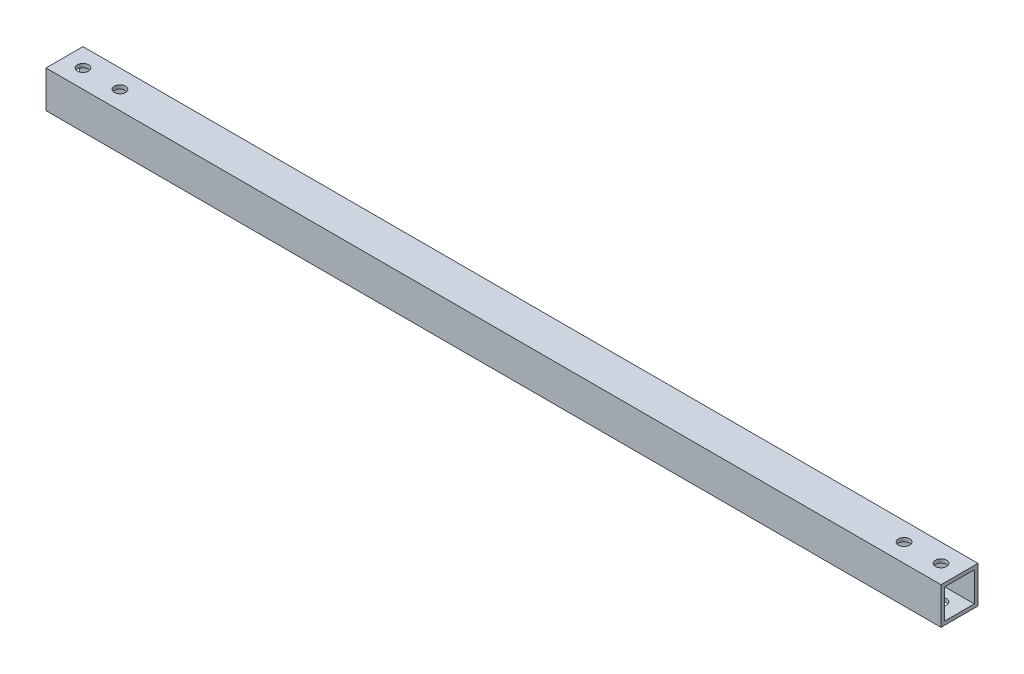
ISO-10303-21;
HEADER;
FILE_DESCRIPTION(('STEP AP214'),'2;1');
FILE_NAME('part.step','',(''),(''),'','','');
FILE_SCHEMA(('AUTOMOTIVE_DESIGN { 1 0 10303 214 1 1 1 1 }'));
ENDSEC;
DATA;
#1=APPLICATION_CONTEXT('core data for automotive mechanical design processes');
#2=APPLICATION_PROTOCOL_DEFINITION('international standard','automotive_design',2000,#1);
#3=PRODUCT_CONTEXT('',#1,'mechanical');
#4=PRODUCT('Part','Part','',(#3));
#5=PRODUCT_RELATED_PRODUCT_CATEGORY('part','',(#4));
#6=PRODUCT_DEFINITION_FORMATION('','',#4);
#7=PRODUCT_DEFINITION_CONTEXT('part definition',#1,'design');
#8=PRODUCT_DEFINITION('design','',#6,#7);
#9=PRODUCT_DEFINITION_SHAPE('','',#8);
#10=(LENGTH_UNIT() NAMED_UNIT(*) SI_UNIT(.MILLI.,.METRE.));
#11=(NAMED_UNIT(*) PLANE_ANGLE_UNIT() SI_UNIT($,.RADIAN.));
#12=(NAMED_UNIT(*) SI_UNIT($,.STERADIAN.) SOLID_ANGLE_UNIT());
#13=UNCERTAINTY_MEASURE_WITH_UNIT(LENGTH_MEASURE(1.E-05),#10,'distance_accuracy_value','');
#14=(GEOMETRIC_REPRESENTATION_CONTEXT(3) GLOBAL_UNCERTAINTY_ASSIGNED_CONTEXT((#13)) GLOBAL_UNIT_ASSIGNED_CONTEXT((#10,
#11,#12)) REPRESENTATION_CONTEXT('',''));
#15=CARTESIAN_POINT('',(0.,0.,0.));
#16=DIRECTION('',(0.,0.,1.));
#17=DIRECTION('',(1.,0.,0.));
#18=AXIS2_PLACEMENT_3D('',#15,#16,#17);
#19=CARTESIAN_POINT('',(242.,0.,0.));
#20=DIRECTION('',(1.,0.,0.));
#21=DIRECTION('',(0.,0.,-1.));
#22=AXIS2_PLACEMENT_3D('',#19,#20,#21);
#23=PLANE('',#22);
#24=DIRECTION('',(0.,-1.,0.));
#25=VECTOR('',#24,1.);
#26=CARTESIAN_POINT('',(242.,10.,10.));
#27=LINE('',#26,#25);
#28=CARTESIAN_POINT('',(242.,10.,10.));
#29=VERTEX_POINT('',#28);
#30=CARTESIAN_POINT('',(242.,-10.,10.));
#31=VERTEX_POINT('',#30);
#32=EDGE_CURVE('E138',#29,#31,#27,.T.);
#33=ORIENTED_EDGE('',*,*,#32,.T.);
#34=DIRECTION('',(0.,0.,-1.));
#35=VECTOR('',#34,1.);
#36=CARTESIAN_POINT('',(242.,-10.,10.));
#37=LINE('',#36,#35);
#38=CARTESIAN_POINT('',(242.,-10.,-10.));
#39=VERTEX_POINT('',#38);
#40=EDGE_CURVE('E141',#31,#39,#37,.T.);
#41=ORIENTED_EDGE('',*,*,#40,.T.);
#42=DIRECTION('',(0.,1.,0.));
#43=VECTOR('',#42,1.);
#44=CARTESIAN_POINT('',(242.,10.,-10.));
#45=LINE('',#44,#43);
#46=CARTESIAN_POINT('',(242.,10.,-10.));
#47=VERTEX_POINT('',#46);
#48=EDGE_CURVE('E144',#39,#47,#45,.T.);
#49=ORIENTED_EDGE('',*,*,#48,.T.);
#50=DIRECTION('',(0.,0.,1.));
#51=VECTOR('',#50,1.);
#52=CARTESIAN_POINT('',(242.,10.,10.));
#53=LINE('',#52,#51);
#54=EDGE_CURVE('E146',#47,#29,#53,.T.);
#55=ORIENTED_EDGE('',*,*,#54,.T.);
#56=EDGE_LOOP('',(#33,#41,#49,#55));
#57=FACE_BOUND('',#56,.T.);
#58=DIRECTION('',(0.,1.,0.));
#59=VECTOR('',#58,1.);
#60=CARTESIAN_POINT('',(242.,8.,-8.));
#61=LINE('',#60,#59);
#62=CARTESIAN_POINT('',(242.,-8.,-8.));
#63=VERTEX_POINT('',#62);
#64=CARTESIAN_POINT('',(242.,8.,-8.));
#65=VERTEX_POINT('',#64);
#66=EDGE_CURVE('E108',#63,#65,#61,.T.);
#67=ORIENTED_EDGE('',*,*,#66,.F.);
#68=DIRECTION('',(0.,0.,-1.));
#69=VECTOR('',#68,1.);
#70=CARTESIAN_POINT('',(242.,-8.,-8.));
#71=LINE('',#70,#69);
#72=CARTESIAN_POINT('',(242.,-8.,8.));
#73=VERTEX_POINT('',#72);
#74=EDGE_CURVE('E100',#73,#63,#71,.T.);
#75=ORIENTED_EDGE('',*,*,#74,.F.);
#76=DIRECTION('',(0.,-1.,0.));
#77=VECTOR('',#76,1.);
#78=CARTESIAN_POINT('',(242.,8.,8.));
#79=LINE('',#78,#77);
#80=CARTESIAN_POINT('',(242.,8.,8.));
#81=VERTEX_POINT('',#80);
#82=EDGE_CURVE('E122',#81,#73,#79,.T.);
#83=ORIENTED_EDGE('',*,*,#82,.F.);
#84=DIRECTION('',(0.,0.,1.));
#85=VECTOR('',#84,1.);
#86=CARTESIAN_POINT('',(242.,8.,-8.));
#87=LINE('',#86,#85);
#88=EDGE_CURVE('E120',#65,#81,#87,.T.);
#89=ORIENTED_EDGE('',*,*,#88,.F.);
#90=EDGE_LOOP('',(#67,#75,#83,#89));
#91=FACE_BOUND('',#90,.T.);
#92=ADVANCED_FACE('F33',(#57,#91),#23,.T.);
#93=CARTESIAN_POINT('',(-242.,0.,0.));
#94=DIRECTION('',(1.,0.,0.));
#95=DIRECTION('',(0.,0.,-1.));
#96=AXIS2_PLACEMENT_3D('',#93,#94,#95);
#97=PLANE('',#96);
#98=DIRECTION('',(0.,-1.,0.));
#99=VECTOR('',#98,1.);
#100=CARTESIAN_POINT('',(-242.,10.,10.));
#101=LINE('',#100,#99);
#102=CARTESIAN_POINT('',(-242.,10.,10.));
#103=VERTEX_POINT('',#102);
#104=CARTESIAN_POINT('',(-242.,-10.,10.));
#105=VERTEX_POINT('',#104);
#106=EDGE_CURVE('E116',#103,#105,#101,.T.);
#107=ORIENTED_EDGE('',*,*,#106,.F.);
#108=DIRECTION('',(0.,0.,1.));
#109=VECTOR('',#108,1.);
#110=CARTESIAN_POINT('',(-242.,10.,10.));
#111=LINE('',#110,#109);
#112=CARTESIAN_POINT('',(-242.,10.,-10.));
#113=VERTEX_POINT('',#112);
#114=EDGE_CURVE('E142',#113,#103,#111,.T.);
#115=ORIENTED_EDGE('',*,*,#114,.F.);
#116=DIRECTION('',(0.,1.,0.));
#117=VECTOR('',#116,1.);
#118=CARTESIAN_POINT('',(-242.,10.,-10.));
#119=LINE('',#118,#117);
#120=CARTESIAN_POINT('',(-242.,-10.,-10.));
#121=VERTEX_POINT('',#120);
#122=EDGE_CURVE('E153',#121,#113,#119,.T.);
#123=ORIENTED_EDGE('',*,*,#122,.F.);
#124=DIRECTION('',(0.,0.,-1.));
#125=VECTOR('',#124,1.);
#126=CARTESIAN_POINT('',(-242.,-10.,10.));
#127=LINE('',#126,#125);
#128=EDGE_CURVE('E151',#105,#121,#127,.T.);
#129=ORIENTED_EDGE('',*,*,#128,.F.);
#130=EDGE_LOOP('',(#107,#115,#123,#129));
#131=FACE_BOUND('',#130,.T.);
#132=DIRECTION('',(0.,0.,-1.));
#133=VECTOR('',#132,1.);
#134=CARTESIAN_POINT('',(-242.,-8.,-8.));
#135=LINE('',#134,#133);
#136=CARTESIAN_POINT('',(-242.,-8.,8.));
#137=VERTEX_POINT('',#136);
#138=CARTESIAN_POINT('',(-242.,-8.,-8.));
#139=VERTEX_POINT('',#138);
#140=EDGE_CURVE('E58',#137,#139,#135,.T.);
#141=ORIENTED_EDGE('',*,*,#140,.T.);
#142=DIRECTION('',(0.,1.,0.));
#143=VECTOR('',#142,1.);
#144=CARTESIAN_POINT('',(-242.,8.,-8.));
#145=LINE('',#144,#143);
#146=CARTESIAN_POINT('',(-242.,8.,-8.));
#147=VERTEX_POINT('',#146);
#148=EDGE_CURVE('E115',#139,#147,#145,.T.);
#149=ORIENTED_EDGE('',*,*,#148,.T.);
#150=DIRECTION('',(0.,0.,1.));
#151=VECTOR('',#150,1.);
#152=CARTESIAN_POINT('',(-242.,8.,-8.));
#153=LINE('',#152,#151);
#154=CARTESIAN_POINT('',(-242.,8.,8.));
#155=VERTEX_POINT('',#154);
#156=EDGE_CURVE('E130',#147,#155,#153,.T.);
#157=ORIENTED_EDGE('',*,*,#156,.T.);
#158=DIRECTION('',(0.,-1.,0.));
#159=VECTOR('',#158,1.);
#160=CARTESIAN_POINT('',(-242.,8.,8.));
#161=LINE('',#160,#159);
#162=EDGE_CURVE('E109',#155,#137,#161,.T.);
#163=ORIENTED_EDGE('',*,*,#162,.T.);
#164=EDGE_LOOP('',(#141,#149,#157,#163));
#165=FACE_BOUND('',#164,.T.);
#166=ADVANCED_FACE('F224',(#131,#165),#97,.F.);
#167=CARTESIAN_POINT('',(242.,10.,10.));
#168=DIRECTION('',(0.,0.,-1.));
#169=DIRECTION('',(-1.,0.,0.));
#170=AXIS2_PLACEMENT_3D('',#167,#168,#169);
#171=PLANE('',#170);
#172=ORIENTED_EDGE('',*,*,#106,.T.);
#173=DIRECTION('',(-1.,0.,0.));
#174=VECTOR('',#173,1.);
#175=CARTESIAN_POINT('',(242.,-10.,10.));
#176=LINE('',#175,#174);
#177=EDGE_CURVE('E11',#31,#105,#176,.T.);
#178=ORIENTED_EDGE('',*,*,#177,.F.);
#179=ORIENTED_EDGE('',*,*,#32,.F.);
#180=DIRECTION('',(-1.,0.,0.));
#181=VECTOR('',#180,1.);
#182=CARTESIAN_POINT('',(242.,10.,10.));
#183=LINE('',#182,#181);
#184=EDGE_CURVE('E148',#29,#103,#183,.T.);
#185=ORIENTED_EDGE('',*,*,#184,.T.);
#186=EDGE_LOOP('',(#172,#178,#179,#185));
#187=FACE_BOUND('',#186,.T.);
#188=ADVANCED_FACE('F35',(#187),#171,.F.);
#189=CARTESIAN_POINT('',(242.,-10.,10.));
#190=DIRECTION('',(0.,1.,0.));
#191=DIRECTION('',(0.,0.,1.));
#192=AXIS2_PLACEMENT_3D('',#189,#190,#191);
#193=PLANE('',#192);
#194=CARTESIAN_POINT('',(-212.,-10.,0.));
#195=DIRECTION('',(0.,1.,0.));
#196=DIRECTION('',(0.,0.,1.));
#197=AXIS2_PLACEMENT_3D('',#194,#195,#196);
#198=CIRCLE('',#197,2.99999999999999);
#199=CARTESIAN_POINT('',(-212.,-10.,2.99999999999999));
#200=VERTEX_POINT('',#199);
#201=EDGE_CURVE('E243',#200,#200,#198,.T.);
#202=ORIENTED_EDGE('',*,*,#201,.T.);
#203=EDGE_LOOP('',(#202));
#204=FACE_BOUND('',#203,.T.);
#205=CARTESIAN_POINT('',(-232.,-10.,0.));
#206=DIRECTION('',(0.,1.,0.));
#207=DIRECTION('',(0.,0.,1.));
#208=AXIS2_PLACEMENT_3D('',#205,#206,#207);
#209=CIRCLE('',#208,2.99999999999999);
#210=CARTESIAN_POINT('',(-232.,-10.,2.99999999999999));
#211=VERTEX_POINT('',#210);
#212=EDGE_CURVE('E174',#211,#211,#209,.T.);
#213=ORIENTED_EDGE('',*,*,#212,.T.);
#214=EDGE_LOOP('',(#213));
#215=FACE_BOUND('',#214,.T.);
#216=CARTESIAN_POINT('',(232.,-10.,0.));
#217=DIRECTION('',(0.,1.,0.));
#218=DIRECTION('',(0.,0.,1.));
#219=AXIS2_PLACEMENT_3D('',#216,#217,#218);
#220=CIRCLE('',#219,2.99999999999999);
#221=CARTESIAN_POINT('',(232.,-10.,2.99999999999999));
#222=VERTEX_POINT('',#221);
#223=EDGE_CURVE('E170',#222,#222,#220,.T.);
#224=ORIENTED_EDGE('',*,*,#223,.T.);
#225=EDGE_LOOP('',(#224));
#226=FACE_BOUND('',#225,.T.);
#227=CARTESIAN_POINT('',(212.,-10.,0.));
#228=DIRECTION('',(0.,1.,0.));
#229=DIRECTION('',(0.,0.,1.));
#230=AXIS2_PLACEMENT_3D('',#227,#228,#229);
#231=CIRCLE('',#230,2.99999999999999);
#232=CARTESIAN_POINT('',(212.,-10.,2.99999999999999));
#233=VERTEX_POINT('',#232);
#234=EDGE_CURVE('E166',#233,#233,#231,.T.);
#235=ORIENTED_EDGE('',*,*,#234,.T.);
#236=EDGE_LOOP('',(#235));
#237=FACE_BOUND('',#236,.T.);
#238=ORIENTED_EDGE('',*,*,#128,.T.);
#239=DIRECTION('',(-1.,0.,0.));
#240=VECTOR('',#239,1.);
#241=CARTESIAN_POINT('',(242.,-10.,-10.));
#242=LINE('',#241,#240);
#243=EDGE_CURVE('E42',#39,#121,#242,.T.);
#244=ORIENTED_EDGE('',*,*,#243,.F.);
#245=ORIENTED_EDGE('',*,*,#40,.F.);
#246=ORIENTED_EDGE('',*,*,#177,.T.);
#247=EDGE_LOOP('',(#238,#244,#245,#246));
#248=FACE_BOUND('',#247,.T.);
#249=ADVANCED_FACE('F233',(#204,#215,#226,#237,#248),#193,.F.);
#250=CARTESIAN_POINT('',(242.,10.,-10.));
#251=DIRECTION('',(0.,0.,1.));
#252=DIRECTION('',(1.,0.,0.));
#253=AXIS2_PLACEMENT_3D('',#250,#251,#252);
#254=PLANE('',#253);
#255=ORIENTED_EDGE('',*,*,#122,.T.);
#256=DIRECTION('',(-1.,0.,0.));
#257=VECTOR('',#256,1.);
#258=CARTESIAN_POINT('',(242.,10.,-10.));
#259=LINE('',#258,#257);
#260=EDGE_CURVE('E158',#47,#113,#259,.T.);
#261=ORIENTED_EDGE('',*,*,#260,.F.);
#262=ORIENTED_EDGE('',*,*,#48,.F.);
#263=ORIENTED_EDGE('',*,*,#243,.T.);
#264=EDGE_LOOP('',(#255,#261,#262,#263));
#265=FACE_BOUND('',#264,.T.);
#266=ADVANCED_FACE('F217',(#265),#254,.F.);
#267=CARTESIAN_POINT('',(242.,10.,10.));
#268=DIRECTION('',(0.,-1.,0.));
#269=DIRECTION('',(0.,0.,-1.));
#270=AXIS2_PLACEMENT_3D('',#267,#268,#269);
#271=PLANE('',#270);
#272=CARTESIAN_POINT('',(-212.,10.,0.));
#273=DIRECTION('',(0.,1.,0.));
#274=DIRECTION('',(0.,0.,1.));
#275=AXIS2_PLACEMENT_3D('',#272,#273,#274);
#276=CIRCLE('',#275,2.99999999999999);
#277=CARTESIAN_POINT('',(-212.,10.,2.99999999999999));
#278=VERTEX_POINT('',#277);
#279=EDGE_CURVE('E299',#278,#278,#276,.T.);
#280=ORIENTED_EDGE('',*,*,#279,.F.);
#281=EDGE_LOOP('',(#280));
#282=FACE_BOUND('',#281,.T.);
#283=CARTESIAN_POINT('',(-232.,10.,0.));
#284=DIRECTION('',(0.,1.,0.));
#285=DIRECTION('',(0.,0.,1.));
#286=AXIS2_PLACEMENT_3D('',#283,#284,#285);
#287=CIRCLE('',#286,2.99999999999999);
#288=CARTESIAN_POINT('',(-232.,10.,2.99999999999999));
#289=VERTEX_POINT('',#288);
#290=EDGE_CURVE('E181',#289,#289,#287,.T.);
#291=ORIENTED_EDGE('',*,*,#290,.F.);
#292=EDGE_LOOP('',(#291));
#293=FACE_BOUND('',#292,.T.);
#294=CARTESIAN_POINT('',(232.,10.,0.));
#295=DIRECTION('',(0.,1.,0.));
#296=DIRECTION('',(0.,0.,1.));
#297=AXIS2_PLACEMENT_3D('',#294,#295,#296);
#298=CIRCLE('',#297,2.99999999999999);
#299=CARTESIAN_POINT('',(232.,10.,2.99999999999999));
#300=VERTEX_POINT('',#299);
#301=EDGE_CURVE('E178',#300,#300,#298,.T.);
#302=ORIENTED_EDGE('',*,*,#301,.F.);
#303=EDGE_LOOP('',(#302));
#304=FACE_BOUND('',#303,.T.);
#305=CARTESIAN_POINT('',(212.,10.,0.));
#306=DIRECTION('',(0.,1.,0.));
#307=DIRECTION('',(0.,0.,1.));
#308=AXIS2_PLACEMENT_3D('',#305,#306,#307);
#309=CIRCLE('',#308,2.99999999999999);
#310=CARTESIAN_POINT('',(212.,10.,2.99999999999999));
#311=VERTEX_POINT('',#310);
#312=EDGE_CURVE('E197',#311,#311,#309,.T.);
#313=ORIENTED_EDGE('',*,*,#312,.F.);
#314=EDGE_LOOP('',(#313));
#315=FACE_BOUND('',#314,.T.);
#316=ORIENTED_EDGE('',*,*,#114,.T.);
#317=ORIENTED_EDGE('',*,*,#184,.F.);
#318=ORIENTED_EDGE('',*,*,#54,.F.);
#319=ORIENTED_EDGE('',*,*,#260,.T.);
#320=EDGE_LOOP('',(#316,#317,#318,#319));
#321=FACE_BOUND('',#320,.T.);
#322=ADVANCED_FACE('F208',(#282,#293,#304,#315,#321),#271,.F.);
#323=CARTESIAN_POINT('',(242.,-8.,-8.));
#324=DIRECTION('',(0.,1.,0.));
#325=DIRECTION('',(0.,0.,1.));
#326=AXIS2_PLACEMENT_3D('',#323,#324,#325);
#327=PLANE('',#326);
#328=CARTESIAN_POINT('',(-212.,-8.,0.));
#329=DIRECTION('',(0.,1.,0.));
#330=DIRECTION('',(0.,0.,1.));
#331=AXIS2_PLACEMENT_3D('',#328,#329,#330);
#332=CIRCLE('',#331,2.99999999999999);
#333=CARTESIAN_POINT('',(-212.,-8.,2.99999999999999));
#334=VERTEX_POINT('',#333);
#335=EDGE_CURVE('E186',#334,#334,#332,.T.);
#336=ORIENTED_EDGE('',*,*,#335,.F.);
#337=EDGE_LOOP('',(#336));
#338=FACE_BOUND('',#337,.T.);
#339=CARTESIAN_POINT('',(-232.,-8.,0.));
#340=DIRECTION('',(0.,1.,0.));
#341=DIRECTION('',(0.,0.,1.));
#342=AXIS2_PLACEMENT_3D('',#339,#340,#341);
#343=CIRCLE('',#342,2.99999999999999);
#344=CARTESIAN_POINT('',(-232.,-8.,2.99999999999999));
#345=VERTEX_POINT('',#344);
#346=EDGE_CURVE('E173',#345,#345,#343,.T.);
#347=ORIENTED_EDGE('',*,*,#346,.F.);
#348=EDGE_LOOP('',(#347));
#349=FACE_BOUND('',#348,.T.);
#350=CARTESIAN_POINT('',(232.,-8.,0.));
#351=DIRECTION('',(0.,1.,0.));
#352=DIRECTION('',(0.,0.,1.));
#353=AXIS2_PLACEMENT_3D('',#350,#351,#352);
#354=CIRCLE('',#353,2.99999999999999);
#355=CARTESIAN_POINT('',(232.,-8.,2.99999999999999));
#356=VERTEX_POINT('',#355);
#357=EDGE_CURVE('E169',#356,#356,#354,.T.);
#358=ORIENTED_EDGE('',*,*,#357,.F.);
#359=EDGE_LOOP('',(#358));
#360=FACE_BOUND('',#359,.T.);
#361=CARTESIAN_POINT('',(212.,-8.,0.));
#362=DIRECTION('',(0.,1.,0.));
#363=DIRECTION('',(0.,0.,1.));
#364=AXIS2_PLACEMENT_3D('',#361,#362,#363);
#365=CIRCLE('',#364,2.99999999999999);
#366=CARTESIAN_POINT('',(212.,-8.,2.99999999999999));
#367=VERTEX_POINT('',#366);
#368=EDGE_CURVE('E128',#367,#367,#365,.T.);
#369=ORIENTED_EDGE('',*,*,#368,.F.);
#370=EDGE_LOOP('',(#369));
#371=FACE_BOUND('',#370,.T.);
#372=ORIENTED_EDGE('',*,*,#140,.F.);
#373=DIRECTION('',(-1.,0.,0.));
#374=VECTOR('',#373,1.);
#375=CARTESIAN_POINT('',(242.,-8.,8.));
#376=LINE('',#375,#374);
#377=EDGE_CURVE('E104',#73,#137,#376,.T.);
#378=ORIENTED_EDGE('',*,*,#377,.F.);
#379=ORIENTED_EDGE('',*,*,#74,.T.);
#380=DIRECTION('',(-1.,0.,0.));
#381=VECTOR('',#380,1.);
#382=CARTESIAN_POINT('',(242.,-8.,-8.));
#383=LINE('',#382,#381);
#384=EDGE_CURVE('E103',#63,#139,#383,.T.);
#385=ORIENTED_EDGE('',*,*,#384,.T.);
#386=EDGE_LOOP('',(#372,#378,#379,#385));
#387=FACE_BOUND('',#386,.T.);
#388=ADVANCED_FACE('F102',(#338,#349,#360,#371,#387),#327,.T.);
#389=CARTESIAN_POINT('',(242.,8.,-8.));
#390=DIRECTION('',(0.,0.,1.));
#391=DIRECTION('',(1.,0.,0.));
#392=AXIS2_PLACEMENT_3D('',#389,#390,#391);
#393=PLANE('',#392);
#394=ORIENTED_EDGE('',*,*,#148,.F.);
#395=ORIENTED_EDGE('',*,*,#384,.F.);
#396=ORIENTED_EDGE('',*,*,#66,.T.);
#397=DIRECTION('',(-1.,0.,0.));
#398=VECTOR('',#397,1.);
#399=CARTESIAN_POINT('',(242.,8.,-8.));
#400=LINE('',#399,#398);
#401=EDGE_CURVE('E117',#65,#147,#400,.T.);
#402=ORIENTED_EDGE('',*,*,#401,.T.);
#403=EDGE_LOOP('',(#394,#395,#396,#402));
#404=FACE_BOUND('',#403,.T.);
#405=ADVANCED_FACE('F112',(#404),#393,.T.);
#406=CARTESIAN_POINT('',(242.,8.,-8.));
#407=DIRECTION('',(0.,-1.,0.));
#408=DIRECTION('',(0.,0.,-1.));
#409=AXIS2_PLACEMENT_3D('',#406,#407,#408);
#410=PLANE('',#409);
#411=CARTESIAN_POINT('',(-212.,8.,0.));
#412=DIRECTION('',(0.,-1.,0.));
#413=DIRECTION('',(0.,0.,-1.));
#414=AXIS2_PLACEMENT_3D('',#411,#412,#413);
#415=CIRCLE('',#414,2.99999999999999);
#416=CARTESIAN_POINT('',(-212.,8.,-2.99999999999999));
#417=VERTEX_POINT('',#416);
#418=EDGE_CURVE('E37',#417,#417,#415,.T.);
#419=ORIENTED_EDGE('',*,*,#418,.F.);
#420=EDGE_LOOP('',(#419));
#421=FACE_BOUND('',#420,.T.);
#422=CARTESIAN_POINT('',(-232.,8.,0.));
#423=DIRECTION('',(0.,-1.,0.));
#424=DIRECTION('',(0.,0.,-1.));
#425=AXIS2_PLACEMENT_3D('',#422,#423,#424);
#426=CIRCLE('',#425,2.99999999999999);
#427=CARTESIAN_POINT('',(-232.,8.,-2.99999999999999));
#428=VERTEX_POINT('',#427);
#429=EDGE_CURVE('E171',#428,#428,#426,.T.);
#430=ORIENTED_EDGE('',*,*,#429,.F.);
#431=EDGE_LOOP('',(#430));
#432=FACE_BOUND('',#431,.T.);
#433=CARTESIAN_POINT('',(232.,8.,0.));
#434=DIRECTION('',(0.,-1.,0.));
#435=DIRECTION('',(0.,0.,-1.));
#436=AXIS2_PLACEMENT_3D('',#433,#434,#435);
#437=CIRCLE('',#436,2.99999999999999);
#438=CARTESIAN_POINT('',(232.,8.,-2.99999999999999));
#439=VERTEX_POINT('',#438);
#440=EDGE_CURVE('E167',#439,#439,#437,.T.);
#441=ORIENTED_EDGE('',*,*,#440,.F.);
#442=EDGE_LOOP('',(#441));
#443=FACE_BOUND('',#442,.T.);
#444=CARTESIAN_POINT('',(212.,8.,0.));
#445=DIRECTION('',(0.,-1.,0.));
#446=DIRECTION('',(0.,0.,-1.));
#447=AXIS2_PLACEMENT_3D('',#444,#445,#446);
#448=CIRCLE('',#447,2.99999999999999);
#449=CARTESIAN_POINT('',(212.,8.,-2.99999999999999));
#450=VERTEX_POINT('',#449);
#451=EDGE_CURVE('E163',#450,#450,#448,.T.);
#452=ORIENTED_EDGE('',*,*,#451,.F.);
#453=EDGE_LOOP('',(#452));
#454=FACE_BOUND('',#453,.T.);
#455=ORIENTED_EDGE('',*,*,#156,.F.);
#456=ORIENTED_EDGE('',*,*,#401,.F.);
#457=ORIENTED_EDGE('',*,*,#88,.T.);
#458=DIRECTION('',(-1.,0.,0.));
#459=VECTOR('',#458,1.);
#460=CARTESIAN_POINT('',(242.,8.,8.));
#461=LINE('',#460,#459);
#462=EDGE_CURVE('E50',#81,#155,#461,.T.);
#463=ORIENTED_EDGE('',*,*,#462,.T.);
#464=EDGE_LOOP('',(#455,#456,#457,#463));
#465=FACE_BOUND('',#464,.T.);
#466=ADVANCED_FACE('F215',(#421,#432,#443,#454,#465),#410,.T.);
#467=CARTESIAN_POINT('',(242.,8.,8.));
#468=DIRECTION('',(0.,0.,-1.));
#469=DIRECTION('',(-1.,0.,0.));
#470=AXIS2_PLACEMENT_3D('',#467,#468,#469);
#471=PLANE('',#470);
#472=ORIENTED_EDGE('',*,*,#162,.F.);
#473=ORIENTED_EDGE('',*,*,#462,.F.);
#474=ORIENTED_EDGE('',*,*,#82,.T.);
#475=ORIENTED_EDGE('',*,*,#377,.T.);
#476=EDGE_LOOP('',(#472,#473,#474,#475));
#477=FACE_BOUND('',#476,.T.);
#478=ADVANCED_FACE('F262',(#477),#471,.T.);
#479=CARTESIAN_POINT('',(212.,-10.,0.));
#480=DIRECTION('',(0.,1.,0.));
#481=DIRECTION('',(0.,0.,1.));
#482=AXIS2_PLACEMENT_3D('',#479,#480,#481);
#483=CYLINDRICAL_SURFACE('',#482,2.99999999999999);
#484=ORIENTED_EDGE('',*,*,#451,.T.);
#485=EDGE_LOOP('',(#484));
#486=FACE_BOUND('',#485,.T.);
#487=ORIENTED_EDGE('',*,*,#312,.T.);
#488=EDGE_LOOP('',(#487));
#489=FACE_BOUND('',#488,.T.);
#490=ADVANCED_FACE('F264',(#486,#489),#483,.F.);
#491=ORIENTED_EDGE('',*,*,#368,.T.);
#492=EDGE_LOOP('',(#491));
#493=FACE_BOUND('',#492,.T.);
#494=ORIENTED_EDGE('',*,*,#234,.F.);
#495=EDGE_LOOP('',(#494));
#496=FACE_BOUND('',#495,.T.);
#497=ADVANCED_FACE('F204',(#493,#496),#483,.F.);
#498=CARTESIAN_POINT('',(232.,-10.,0.));
#499=DIRECTION('',(0.,1.,0.));
#500=DIRECTION('',(0.,0.,1.));
#501=AXIS2_PLACEMENT_3D('',#498,#499,#500);
#502=CYLINDRICAL_SURFACE('',#501,2.99999999999999);
#503=ORIENTED_EDGE('',*,*,#440,.T.);
#504=EDGE_LOOP('',(#503));
#505=FACE_BOUND('',#504,.T.);
#506=ORIENTED_EDGE('',*,*,#301,.T.);
#507=EDGE_LOOP('',(#506));
#508=FACE_BOUND('',#507,.T.);
#509=ADVANCED_FACE('F275',(#505,#508),#502,.F.);
#510=ORIENTED_EDGE('',*,*,#357,.T.);
#511=EDGE_LOOP('',(#510));
#512=FACE_BOUND('',#511,.T.);
#513=ORIENTED_EDGE('',*,*,#223,.F.);
#514=EDGE_LOOP('',(#513));
#515=FACE_BOUND('',#514,.T.);
#516=ADVANCED_FACE('F278',(#512,#515),#502,.F.);
#517=CARTESIAN_POINT('',(-232.,-10.,0.));
#518=DIRECTION('',(0.,1.,0.));
#519=DIRECTION('',(0.,0.,1.));
#520=AXIS2_PLACEMENT_3D('',#517,#518,#519);
#521=CYLINDRICAL_SURFACE('',#520,2.99999999999999);
#522=ORIENTED_EDGE('',*,*,#429,.T.);
#523=EDGE_LOOP('',(#522));
#524=FACE_BOUND('',#523,.T.);
#525=ORIENTED_EDGE('',*,*,#290,.T.);
#526=EDGE_LOOP('',(#525));
#527=FACE_BOUND('',#526,.T.);
#528=ADVANCED_FACE('F280',(#524,#527),#521,.F.);
#529=ORIENTED_EDGE('',*,*,#346,.T.);
#530=EDGE_LOOP('',(#529));
#531=FACE_BOUND('',#530,.T.);
#532=ORIENTED_EDGE('',*,*,#212,.F.);
#533=EDGE_LOOP('',(#532));
#534=FACE_BOUND('',#533,.T.);
#535=ADVANCED_FACE('F283',(#531,#534),#521,.F.);
#536=CARTESIAN_POINT('',(-212.,-10.,0.));
#537=DIRECTION('',(0.,1.,0.));
#538=DIRECTION('',(0.,0.,1.));
#539=AXIS2_PLACEMENT_3D('',#536,#537,#538);
#540=CYLINDRICAL_SURFACE('',#539,2.99999999999999);
#541=ORIENTED_EDGE('',*,*,#418,.T.);
#542=EDGE_LOOP('',(#541));
#543=FACE_BOUND('',#542,.T.);
#544=ORIENTED_EDGE('',*,*,#279,.T.);
#545=EDGE_LOOP('',(#544));
#546=FACE_BOUND('',#545,.T.);
#547=ADVANCED_FACE('F284',(#543,#546),#540,.F.);
#548=ORIENTED_EDGE('',*,*,#335,.T.);
#549=EDGE_LOOP('',(#548));
#550=FACE_BOUND('',#549,.T.);
#551=ORIENTED_EDGE('',*,*,#201,.F.);
#552=EDGE_LOOP('',(#551));
#553=FACE_BOUND('',#552,.T.);
#554=ADVANCED_FACE('F286',(#550,#553),#540,.F.);
#555=CLOSED_SHELL('',(#92,#166,#188,#249,#266,#322,#388,#405,#466,#478,#490,#497,#509,#516,#528,
#535,#547,#554));
#556=MANIFOLD_SOLID_BREP('B2',#555);
#557=ADVANCED_BREP_SHAPE_REPRESENTATION('',(#18,#556),#14);
#558=SHAPE_DEFINITION_REPRESENTATION(#9,#557);
ENDSEC;
END-ISO-10303-21;
